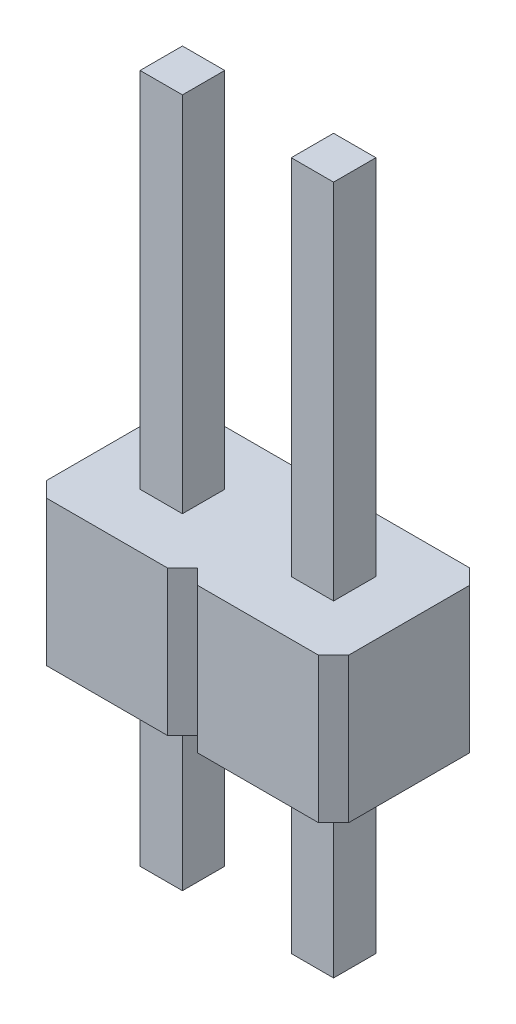
ISO-10303-21;
HEADER;
FILE_DESCRIPTION(('STEP AP214'),'2;1');
FILE_NAME('part.step','',(''),(''),'','','');
FILE_SCHEMA(('AUTOMOTIVE_DESIGN { 1 0 10303 214 1 1 1 1 }'));
ENDSEC;
DATA;
#1=APPLICATION_CONTEXT('core data for automotive mechanical design processes');
#2=APPLICATION_PROTOCOL_DEFINITION('international standard','automotive_design',2000,#1);
#3=PRODUCT_CONTEXT('',#1,'mechanical');
#4=PRODUCT('Part','Part','',(#3));
#5=PRODUCT_RELATED_PRODUCT_CATEGORY('part','',(#4));
#6=PRODUCT_DEFINITION_FORMATION('','',#4);
#7=PRODUCT_DEFINITION_CONTEXT('part definition',#1,'design');
#8=PRODUCT_DEFINITION('design','',#6,#7);
#9=PRODUCT_DEFINITION_SHAPE('','',#8);
#10=(LENGTH_UNIT() NAMED_UNIT(*) SI_UNIT(.MILLI.,.METRE.));
#11=(NAMED_UNIT(*) PLANE_ANGLE_UNIT() SI_UNIT($,.RADIAN.));
#12=(NAMED_UNIT(*) SI_UNIT($,.STERADIAN.) SOLID_ANGLE_UNIT());
#13=UNCERTAINTY_MEASURE_WITH_UNIT(LENGTH_MEASURE(1.E-05),#10,'distance_accuracy_value','');
#14=(GEOMETRIC_REPRESENTATION_CONTEXT(3) GLOBAL_UNCERTAINTY_ASSIGNED_CONTEXT((#13)) GLOBAL_UNIT_ASSIGNED_CONTEXT((#10,
#11,#12)) REPRESENTATION_CONTEXT('',''));
#15=CARTESIAN_POINT('',(0.,0.,0.));
#16=DIRECTION('',(0.,0.,1.));
#17=DIRECTION('',(1.,0.,0.));
#18=AXIS2_PLACEMENT_3D('',#15,#16,#17);
#19=CARTESIAN_POINT('',(0.,2.4,0.));
#20=DIRECTION('',(0.,-1.,0.));
#21=DIRECTION('',(0.,0.,-1.));
#22=AXIS2_PLACEMENT_3D('',#19,#20,#21);
#23=PLANE('',#22);
#24=DIRECTION('',(0.,0.,-1.));
#25=VECTOR('',#24,1.);
#26=CARTESIAN_POINT('',(-0.9,2.4,-0.35));
#27=LINE('',#26,#25);
#28=CARTESIAN_POINT('',(-0.9,2.4,0.35));
#29=VERTEX_POINT('',#28);
#30=CARTESIAN_POINT('',(-0.9,2.4,-0.35));
#31=VERTEX_POINT('',#30);
#32=EDGE_CURVE('E310',#29,#31,#27,.T.);
#33=ORIENTED_EDGE('',*,*,#32,.F.);
#34=DIRECTION('',(1.,0.,0.));
#35=VECTOR('',#34,1.);
#36=CARTESIAN_POINT('',(-1.6,2.4,0.35));
#37=LINE('',#36,#35);
#38=CARTESIAN_POINT('',(-1.6,2.4,0.35));
#39=VERTEX_POINT('',#38);
#40=EDGE_CURVE('E315',#39,#29,#37,.T.);
#41=ORIENTED_EDGE('',*,*,#40,.F.);
#42=DIRECTION('',(0.,0.,1.));
#43=VECTOR('',#42,1.);
#44=CARTESIAN_POINT('',(-1.6,2.4,-0.35));
#45=LINE('',#44,#43);
#46=CARTESIAN_POINT('',(-1.6,2.4,-0.35));
#47=VERTEX_POINT('',#46);
#48=EDGE_CURVE('E327',#47,#39,#45,.T.);
#49=ORIENTED_EDGE('',*,*,#48,.F.);
#50=DIRECTION('',(-1.,0.,0.));
#51=VECTOR('',#50,1.);
#52=CARTESIAN_POINT('',(-1.6,2.4,-0.35));
#53=LINE('',#52,#51);
#54=EDGE_CURVE('E324',#31,#47,#53,.T.);
#55=ORIENTED_EDGE('',*,*,#54,.F.);
#56=EDGE_LOOP('',(#33,#41,#49,#55));
#57=FACE_BOUND('',#56,.T.);
#58=DIRECTION('',(-0.707106781186548,0.,0.707106781186547));
#59=VECTOR('',#58,1.);
#60=CARTESIAN_POINT('',(-2.5,2.4,-1.));
#61=LINE('',#60,#59);
#62=CARTESIAN_POINT('',(-2.25,2.4,-1.25));
#63=VERTEX_POINT('',#62);
#64=CARTESIAN_POINT('',(-2.5,2.4,-1.));
#65=VERTEX_POINT('',#64);
#66=EDGE_CURVE('E344',#63,#65,#61,.T.);
#67=ORIENTED_EDGE('',*,*,#66,.T.);
#68=DIRECTION('',(0.,0.,1.));
#69=VECTOR('',#68,1.);
#70=CARTESIAN_POINT('',(-2.5,2.4,-1.));
#71=LINE('',#70,#69);
#72=CARTESIAN_POINT('',(-2.5,2.4,0.999999999999998));
#73=VERTEX_POINT('',#72);
#74=EDGE_CURVE('E347',#65,#73,#71,.T.);
#75=ORIENTED_EDGE('',*,*,#74,.T.);
#76=DIRECTION('',(0.707106781186544,0.,0.707106781186551));
#77=VECTOR('',#76,1.);
#78=CARTESIAN_POINT('',(-2.5,2.4,0.999999999999998));
#79=LINE('',#78,#77);
#80=CARTESIAN_POINT('',(-2.25,2.4,1.25));
#81=VERTEX_POINT('',#80);
#82=EDGE_CURVE('E350',#73,#81,#79,.T.);
#83=ORIENTED_EDGE('',*,*,#82,.T.);
#84=DIRECTION('',(1.,0.,0.));
#85=VECTOR('',#84,1.);
#86=CARTESIAN_POINT('',(-2.25,2.4,1.25));
#87=LINE('',#86,#85);
#88=CARTESIAN_POINT('',(-0.250000000000003,2.4,1.25));
#89=VERTEX_POINT('',#88);
#90=EDGE_CURVE('E352',#81,#89,#87,.T.);
#91=ORIENTED_EDGE('',*,*,#90,.T.);
#92=DIRECTION('',(0.707106781186551,0.,-0.707106781186544));
#93=VECTOR('',#92,1.);
#94=CARTESIAN_POINT('',(-0.250000000000003,2.4,1.25));
#95=LINE('',#94,#93);
#96=CARTESIAN_POINT('',(0.,2.4,0.999999999999999));
#97=VERTEX_POINT('',#96);
#98=EDGE_CURVE('E354',#89,#97,#95,.T.);
#99=ORIENTED_EDGE('',*,*,#98,.T.);
#100=DIRECTION('',(0.707106781186544,0.,0.707106781186551));
#101=VECTOR('',#100,1.);
#102=CARTESIAN_POINT('',(0.,2.4,0.999999999999999));
#103=LINE('',#102,#101);
#104=CARTESIAN_POINT('',(0.25,2.4,1.25));
#105=VERTEX_POINT('',#104);
#106=EDGE_CURVE('E356',#97,#105,#103,.T.);
#107=ORIENTED_EDGE('',*,*,#106,.T.);
#108=DIRECTION('',(1.,0.,0.));
#109=VECTOR('',#108,1.);
#110=CARTESIAN_POINT('',(0.25,2.4,1.25));
#111=LINE('',#110,#109);
#112=CARTESIAN_POINT('',(2.25,2.4,1.25));
#113=VERTEX_POINT('',#112);
#114=EDGE_CURVE('E358',#105,#113,#111,.T.);
#115=ORIENTED_EDGE('',*,*,#114,.T.);
#116=DIRECTION('',(0.707106781186546,0.,-0.707106781186549));
#117=VECTOR('',#116,1.);
#118=CARTESIAN_POINT('',(2.25,2.4,1.25));
#119=LINE('',#118,#117);
#120=CARTESIAN_POINT('',(2.5,2.4,0.999999999999999));
#121=VERTEX_POINT('',#120);
#122=EDGE_CURVE('E360',#113,#121,#119,.T.);
#123=ORIENTED_EDGE('',*,*,#122,.T.);
#124=DIRECTION('',(0.,0.,-1.));
#125=VECTOR('',#124,1.);
#126=CARTESIAN_POINT('',(2.5,2.4,-1.));
#127=LINE('',#126,#125);
#128=CARTESIAN_POINT('',(2.5,2.4,-1.));
#129=VERTEX_POINT('',#128);
#130=EDGE_CURVE('E362',#121,#129,#127,.T.);
#131=ORIENTED_EDGE('',*,*,#130,.T.);
#132=DIRECTION('',(-0.707106781186547,0.,-0.707106781186547));
#133=VECTOR('',#132,1.);
#134=CARTESIAN_POINT('',(2.5,2.4,-1.));
#135=LINE('',#134,#133);
#136=CARTESIAN_POINT('',(2.25,2.4,-1.25));
#137=VERTEX_POINT('',#136);
#138=EDGE_CURVE('E364',#129,#137,#135,.T.);
#139=ORIENTED_EDGE('',*,*,#138,.T.);
#140=DIRECTION('',(-1.,0.,0.));
#141=VECTOR('',#140,1.);
#142=CARTESIAN_POINT('',(0.25,2.4,-1.25));
#143=LINE('',#142,#141);
#144=CARTESIAN_POINT('',(0.25,2.4,-1.25));
#145=VERTEX_POINT('',#144);
#146=EDGE_CURVE('E366',#137,#145,#143,.T.);
#147=ORIENTED_EDGE('',*,*,#146,.T.);
#148=DIRECTION('',(-0.707106781186546,0.,0.707106781186549));
#149=VECTOR('',#148,1.);
#150=CARTESIAN_POINT('',(0.,2.4,-1.));
#151=LINE('',#150,#149);
#152=CARTESIAN_POINT('',(0.,2.4,-1.));
#153=VERTEX_POINT('',#152);
#154=EDGE_CURVE('E368',#145,#153,#151,.T.);
#155=ORIENTED_EDGE('',*,*,#154,.T.);
#156=DIRECTION('',(-0.707106781186548,0.,-0.707106781186547));
#157=VECTOR('',#156,1.);
#158=CARTESIAN_POINT('',(-0.25,2.4,-1.25));
#159=LINE('',#158,#157);
#160=CARTESIAN_POINT('',(-0.25,2.4,-1.25));
#161=VERTEX_POINT('',#160);
#162=EDGE_CURVE('E370',#153,#161,#159,.T.);
#163=ORIENTED_EDGE('',*,*,#162,.T.);
#164=DIRECTION('',(-1.,0.,0.));
#165=VECTOR('',#164,1.);
#166=CARTESIAN_POINT('',(-2.25,2.4,-1.25));
#167=LINE('',#166,#165);
#168=EDGE_CURVE('E372',#161,#63,#167,.T.);
#169=ORIENTED_EDGE('',*,*,#168,.T.);
#170=EDGE_LOOP('',(#67,#75,#83,#91,#99,#107,#115,#123,#131,#139,#147,#155,#163,#169));
#171=FACE_BOUND('',#170,.T.);
#172=DIRECTION('',(0.,0.,-1.));
#173=VECTOR('',#172,1.);
#174=CARTESIAN_POINT('',(1.6,2.4,-0.35));
#175=LINE('',#174,#173);
#176=CARTESIAN_POINT('',(1.6,2.4,0.35));
#177=VERTEX_POINT('',#176);
#178=CARTESIAN_POINT('',(1.6,2.4,-0.35));
#179=VERTEX_POINT('',#178);
#180=EDGE_CURVE('E272',#177,#179,#175,.T.);
#181=ORIENTED_EDGE('',*,*,#180,.F.);
#182=DIRECTION('',(1.,0.,0.));
#183=VECTOR('',#182,1.);
#184=CARTESIAN_POINT('',(0.900000000000001,2.4,0.35));
#185=LINE('',#184,#183);
#186=CARTESIAN_POINT('',(0.900000000000001,2.4,0.35));
#187=VERTEX_POINT('',#186);
#188=EDGE_CURVE('E282',#187,#177,#185,.T.);
#189=ORIENTED_EDGE('',*,*,#188,.F.);
#190=DIRECTION('',(0.,0.,1.));
#191=VECTOR('',#190,1.);
#192=CARTESIAN_POINT('',(0.9,2.4,-0.35));
#193=LINE('',#192,#191);
#194=CARTESIAN_POINT('',(0.9,2.4,-0.35));
#195=VERTEX_POINT('',#194);
#196=EDGE_CURVE('E294',#195,#187,#193,.T.);
#197=ORIENTED_EDGE('',*,*,#196,.F.);
#198=DIRECTION('',(-1.,0.,0.));
#199=VECTOR('',#198,1.);
#200=CARTESIAN_POINT('',(0.9,2.4,-0.35));
#201=LINE('',#200,#199);
#202=EDGE_CURVE('E291',#179,#195,#201,.T.);
#203=ORIENTED_EDGE('',*,*,#202,.F.);
#204=EDGE_LOOP('',(#181,#189,#197,#203));
#205=FACE_BOUND('',#204,.T.);
#206=ADVANCED_FACE('F33',(#57,#171,#205),#23,.F.);
#207=CARTESIAN_POINT('',(-2.5,2.4,-1.));
#208=DIRECTION('',(0.707106781186547,0.,0.707106781186548));
#209=DIRECTION('',(0.707106781186548,0.,-0.707106781186547));
#210=AXIS2_PLACEMENT_3D('',#207,#208,#209);
#211=PLANE('',#210);
#212=DIRECTION('',(-0.707106781186548,0.,0.707106781186547));
#213=VECTOR('',#212,1.);
#214=CARTESIAN_POINT('',(-2.5,0.,-1.));
#215=LINE('',#214,#213);
#216=CARTESIAN_POINT('',(-2.25,0.,-1.25));
#217=VERTEX_POINT('',#216);
#218=CARTESIAN_POINT('',(-2.5,0.,-1.));
#219=VERTEX_POINT('',#218);
#220=EDGE_CURVE('E343',#217,#219,#215,.T.);
#221=ORIENTED_EDGE('',*,*,#220,.T.);
#222=DIRECTION('',(0.,-1.,0.));
#223=VECTOR('',#222,1.);
#224=CARTESIAN_POINT('',(-2.5,2.4,-1.));
#225=LINE('',#224,#223);
#226=EDGE_CURVE('E440',#65,#219,#225,.T.);
#227=ORIENTED_EDGE('',*,*,#226,.F.);
#228=ORIENTED_EDGE('',*,*,#66,.F.);
#229=DIRECTION('',(0.,-1.,0.));
#230=VECTOR('',#229,1.);
#231=CARTESIAN_POINT('',(-2.25,2.4,-1.25));
#232=LINE('',#231,#230);
#233=EDGE_CURVE('E374',#63,#217,#232,.T.);
#234=ORIENTED_EDGE('',*,*,#233,.T.);
#235=EDGE_LOOP('',(#221,#227,#228,#234));
#236=FACE_BOUND('',#235,.T.);
#237=ADVANCED_FACE('F35',(#236),#211,.F.);
#238=CARTESIAN_POINT('',(-2.5,2.4,-1.));
#239=DIRECTION('',(1.,0.,0.));
#240=DIRECTION('',(0.,0.,-1.));
#241=AXIS2_PLACEMENT_3D('',#238,#239,#240);
#242=PLANE('',#241);
#243=DIRECTION('',(0.,0.,1.));
#244=VECTOR('',#243,1.);
#245=CARTESIAN_POINT('',(-2.5,0.,-1.));
#246=LINE('',#245,#244);
#247=CARTESIAN_POINT('',(-2.5,0.,0.999999999999998));
#248=VERTEX_POINT('',#247);
#249=EDGE_CURVE('E377',#219,#248,#246,.T.);
#250=ORIENTED_EDGE('',*,*,#249,.T.);
#251=DIRECTION('',(0.,-1.,0.));
#252=VECTOR('',#251,1.);
#253=CARTESIAN_POINT('',(-2.5,2.4,0.999999999999998));
#254=LINE('',#253,#252);
#255=EDGE_CURVE('E437',#73,#248,#254,.T.);
#256=ORIENTED_EDGE('',*,*,#255,.F.);
#257=ORIENTED_EDGE('',*,*,#74,.F.);
#258=ORIENTED_EDGE('',*,*,#226,.T.);
#259=EDGE_LOOP('',(#250,#256,#257,#258));
#260=FACE_BOUND('',#259,.T.);
#261=ADVANCED_FACE('F535',(#260),#242,.F.);
#262=CARTESIAN_POINT('',(-2.5,2.4,0.999999999999998));
#263=DIRECTION('',(0.70710678118655,0.,-0.707106781186544));
#264=DIRECTION('',(-0.707106781186545,0.,-0.707106781186551));
#265=AXIS2_PLACEMENT_3D('',#262,#263,#264);
#266=PLANE('',#265);
#267=DIRECTION('',(0.707106781186544,0.,0.707106781186551));
#268=VECTOR('',#267,1.);
#269=CARTESIAN_POINT('',(-2.5,0.,0.999999999999998));
#270=LINE('',#269,#268);
#271=CARTESIAN_POINT('',(-2.25,0.,1.25));
#272=VERTEX_POINT('',#271);
#273=EDGE_CURVE('E379',#248,#272,#270,.T.);
#274=ORIENTED_EDGE('',*,*,#273,.T.);
#275=DIRECTION('',(0.,-1.,0.));
#276=VECTOR('',#275,1.);
#277=CARTESIAN_POINT('',(-2.25,2.4,1.25));
#278=LINE('',#277,#276);
#279=EDGE_CURVE('E434',#81,#272,#278,.T.);
#280=ORIENTED_EDGE('',*,*,#279,.F.);
#281=ORIENTED_EDGE('',*,*,#82,.F.);
#282=ORIENTED_EDGE('',*,*,#255,.T.);
#283=EDGE_LOOP('',(#274,#280,#281,#282));
#284=FACE_BOUND('',#283,.T.);
#285=ADVANCED_FACE('F531',(#284),#266,.F.);
#286=CARTESIAN_POINT('',(-2.25,2.4,1.25));
#287=DIRECTION('',(0.,0.,-1.));
#288=DIRECTION('',(-1.,0.,0.));
#289=AXIS2_PLACEMENT_3D('',#286,#287,#288);
#290=PLANE('',#289);
#291=DIRECTION('',(1.,0.,0.));
#292=VECTOR('',#291,1.);
#293=CARTESIAN_POINT('',(-2.25,0.,1.25));
#294=LINE('',#293,#292);
#295=CARTESIAN_POINT('',(-0.250000000000003,0.,1.25));
#296=VERTEX_POINT('',#295);
#297=EDGE_CURVE('E381',#272,#296,#294,.T.);
#298=ORIENTED_EDGE('',*,*,#297,.T.);
#299=DIRECTION('',(0.,-1.,0.));
#300=VECTOR('',#299,1.);
#301=CARTESIAN_POINT('',(-0.250000000000003,2.4,1.25));
#302=LINE('',#301,#300);
#303=EDGE_CURVE('E431',#89,#296,#302,.T.);
#304=ORIENTED_EDGE('',*,*,#303,.F.);
#305=ORIENTED_EDGE('',*,*,#90,.F.);
#306=ORIENTED_EDGE('',*,*,#279,.T.);
#307=EDGE_LOOP('',(#298,#304,#305,#306));
#308=FACE_BOUND('',#307,.T.);
#309=ADVANCED_FACE('F528',(#308),#290,.F.);
#310=CARTESIAN_POINT('',(-0.250000000000003,2.4,1.25));
#311=DIRECTION('',(-0.707106781186544,0.,-0.707106781186551));
#312=DIRECTION('',(-0.707106781186551,0.,0.707106781186544));
#313=AXIS2_PLACEMENT_3D('',#310,#311,#312);
#314=PLANE('',#313);
#315=DIRECTION('',(0.707106781186551,0.,-0.707106781186544));
#316=VECTOR('',#315,1.);
#317=CARTESIAN_POINT('',(-0.250000000000003,0.,1.25));
#318=LINE('',#317,#316);
#319=CARTESIAN_POINT('',(0.,0.,0.999999999999999));
#320=VERTEX_POINT('',#319);
#321=EDGE_CURVE('E383',#296,#320,#318,.T.);
#322=ORIENTED_EDGE('',*,*,#321,.T.);
#323=DIRECTION('',(0.,-1.,0.));
#324=VECTOR('',#323,1.);
#325=CARTESIAN_POINT('',(0.,2.4,0.999999999999999));
#326=LINE('',#325,#324);
#327=EDGE_CURVE('E428',#97,#320,#326,.T.);
#328=ORIENTED_EDGE('',*,*,#327,.F.);
#329=ORIENTED_EDGE('',*,*,#98,.F.);
#330=ORIENTED_EDGE('',*,*,#303,.T.);
#331=EDGE_LOOP('',(#322,#328,#329,#330));
#332=FACE_BOUND('',#331,.T.);
#333=ADVANCED_FACE('F524',(#332),#314,.F.);
#334=CARTESIAN_POINT('',(0.,2.4,0.999999999999999));
#335=DIRECTION('',(0.707106781186551,0.,-0.707106781186544));
#336=DIRECTION('',(-0.707106781186544,0.,-0.707106781186551));
#337=AXIS2_PLACEMENT_3D('',#334,#335,#336);
#338=PLANE('',#337);
#339=DIRECTION('',(0.707106781186544,0.,0.707106781186551));
#340=VECTOR('',#339,1.);
#341=CARTESIAN_POINT('',(0.,0.,0.999999999999999));
#342=LINE('',#341,#340);
#343=CARTESIAN_POINT('',(0.25,0.,1.25));
#344=VERTEX_POINT('',#343);
#345=EDGE_CURVE('E385',#320,#344,#342,.T.);
#346=ORIENTED_EDGE('',*,*,#345,.T.);
#347=DIRECTION('',(0.,-1.,0.));
#348=VECTOR('',#347,1.);
#349=CARTESIAN_POINT('',(0.25,2.4,1.25));
#350=LINE('',#349,#348);
#351=EDGE_CURVE('E425',#105,#344,#350,.T.);
#352=ORIENTED_EDGE('',*,*,#351,.F.);
#353=ORIENTED_EDGE('',*,*,#106,.F.);
#354=ORIENTED_EDGE('',*,*,#327,.T.);
#355=EDGE_LOOP('',(#346,#352,#353,#354));
#356=FACE_BOUND('',#355,.T.);
#357=ADVANCED_FACE('F519',(#356),#338,.F.);
#358=CARTESIAN_POINT('',(0.25,2.4,1.25));
#359=DIRECTION('',(0.,0.,-1.));
#360=DIRECTION('',(-1.,0.,0.));
#361=AXIS2_PLACEMENT_3D('',#358,#359,#360);
#362=PLANE('',#361);
#363=DIRECTION('',(1.,0.,0.));
#364=VECTOR('',#363,1.);
#365=CARTESIAN_POINT('',(0.25,0.,1.25));
#366=LINE('',#365,#364);
#367=CARTESIAN_POINT('',(2.25,0.,1.25));
#368=VERTEX_POINT('',#367);
#369=EDGE_CURVE('E387',#344,#368,#366,.T.);
#370=ORIENTED_EDGE('',*,*,#369,.T.);
#371=DIRECTION('',(0.,-1.,0.));
#372=VECTOR('',#371,1.);
#373=CARTESIAN_POINT('',(2.25,2.4,1.25));
#374=LINE('',#373,#372);
#375=EDGE_CURVE('E422',#113,#368,#374,.T.);
#376=ORIENTED_EDGE('',*,*,#375,.F.);
#377=ORIENTED_EDGE('',*,*,#114,.F.);
#378=ORIENTED_EDGE('',*,*,#351,.T.);
#379=EDGE_LOOP('',(#370,#376,#377,#378));
#380=FACE_BOUND('',#379,.T.);
#381=ADVANCED_FACE('F513',(#380),#362,.F.);
#382=CARTESIAN_POINT('',(2.25,2.4,1.25));
#383=DIRECTION('',(-0.707106781186549,0.,-0.707106781186546));
#384=DIRECTION('',(-0.707106781186546,0.,0.707106781186549));
#385=AXIS2_PLACEMENT_3D('',#382,#383,#384);
#386=PLANE('',#385);
#387=DIRECTION('',(0.707106781186546,0.,-0.707106781186549));
#388=VECTOR('',#387,1.);
#389=CARTESIAN_POINT('',(2.25,0.,1.25));
#390=LINE('',#389,#388);
#391=CARTESIAN_POINT('',(2.5,0.,0.999999999999999));
#392=VERTEX_POINT('',#391);
#393=EDGE_CURVE('E389',#368,#392,#390,.T.);
#394=ORIENTED_EDGE('',*,*,#393,.T.);
#395=DIRECTION('',(0.,-1.,0.));
#396=VECTOR('',#395,1.);
#397=CARTESIAN_POINT('',(2.5,2.4,0.999999999999999));
#398=LINE('',#397,#396);
#399=EDGE_CURVE('E419',#121,#392,#398,.T.);
#400=ORIENTED_EDGE('',*,*,#399,.F.);
#401=ORIENTED_EDGE('',*,*,#122,.F.);
#402=ORIENTED_EDGE('',*,*,#375,.T.);
#403=EDGE_LOOP('',(#394,#400,#401,#402));
#404=FACE_BOUND('',#403,.T.);
#405=ADVANCED_FACE('F509',(#404),#386,.F.);
#406=CARTESIAN_POINT('',(2.5,2.4,-1.));
#407=DIRECTION('',(-1.,0.,0.));
#408=DIRECTION('',(0.,0.,1.));
#409=AXIS2_PLACEMENT_3D('',#406,#407,#408);
#410=PLANE('',#409);
#411=DIRECTION('',(0.,0.,-1.));
#412=VECTOR('',#411,1.);
#413=CARTESIAN_POINT('',(2.5,0.,-1.));
#414=LINE('',#413,#412);
#415=CARTESIAN_POINT('',(2.5,0.,-1.));
#416=VERTEX_POINT('',#415);
#417=EDGE_CURVE('E391',#392,#416,#414,.T.);
#418=ORIENTED_EDGE('',*,*,#417,.T.);
#419=DIRECTION('',(0.,-1.,0.));
#420=VECTOR('',#419,1.);
#421=CARTESIAN_POINT('',(2.5,2.4,-1.));
#422=LINE('',#421,#420);
#423=EDGE_CURVE('E416',#129,#416,#422,.T.);
#424=ORIENTED_EDGE('',*,*,#423,.F.);
#425=ORIENTED_EDGE('',*,*,#130,.F.);
#426=ORIENTED_EDGE('',*,*,#399,.T.);
#427=EDGE_LOOP('',(#418,#424,#425,#426));
#428=FACE_BOUND('',#427,.T.);
#429=ADVANCED_FACE('F504',(#428),#410,.F.);
#430=CARTESIAN_POINT('',(2.5,2.4,-1.));
#431=DIRECTION('',(-0.707106781186547,0.,0.707106781186547));
#432=DIRECTION('',(0.707106781186548,0.,0.707106781186548));
#433=AXIS2_PLACEMENT_3D('',#430,#431,#432);
#434=PLANE('',#433);
#435=DIRECTION('',(-0.707106781186547,0.,-0.707106781186547));
#436=VECTOR('',#435,1.);
#437=CARTESIAN_POINT('',(2.5,0.,-1.));
#438=LINE('',#437,#436);
#439=CARTESIAN_POINT('',(2.25,0.,-1.25));
#440=VERTEX_POINT('',#439);
#441=EDGE_CURVE('E393',#416,#440,#438,.T.);
#442=ORIENTED_EDGE('',*,*,#441,.T.);
#443=DIRECTION('',(0.,-1.,0.));
#444=VECTOR('',#443,1.);
#445=CARTESIAN_POINT('',(2.25,2.4,-1.25));
#446=LINE('',#445,#444);
#447=EDGE_CURVE('E413',#137,#440,#446,.T.);
#448=ORIENTED_EDGE('',*,*,#447,.F.);
#449=ORIENTED_EDGE('',*,*,#138,.F.);
#450=ORIENTED_EDGE('',*,*,#423,.T.);
#451=EDGE_LOOP('',(#442,#448,#449,#450));
#452=FACE_BOUND('',#451,.T.);
#453=ADVANCED_FACE('F498',(#452),#434,.F.);
#454=CARTESIAN_POINT('',(0.25,2.4,-1.25));
#455=DIRECTION('',(0.,0.,1.));
#456=DIRECTION('',(1.,0.,0.));
#457=AXIS2_PLACEMENT_3D('',#454,#455,#456);
#458=PLANE('',#457);
#459=DIRECTION('',(-1.,0.,0.));
#460=VECTOR('',#459,1.);
#461=CARTESIAN_POINT('',(0.25,0.,-1.25));
#462=LINE('',#461,#460);
#463=CARTESIAN_POINT('',(0.25,0.,-1.25));
#464=VERTEX_POINT('',#463);
#465=EDGE_CURVE('E395',#440,#464,#462,.T.);
#466=ORIENTED_EDGE('',*,*,#465,.T.);
#467=DIRECTION('',(0.,-1.,0.));
#468=VECTOR('',#467,1.);
#469=CARTESIAN_POINT('',(0.25,2.4,-1.25));
#470=LINE('',#469,#468);
#471=EDGE_CURVE('E410',#145,#464,#470,.T.);
#472=ORIENTED_EDGE('',*,*,#471,.F.);
#473=ORIENTED_EDGE('',*,*,#146,.F.);
#474=ORIENTED_EDGE('',*,*,#447,.T.);
#475=EDGE_LOOP('',(#466,#472,#473,#474));
#476=FACE_BOUND('',#475,.T.);
#477=ADVANCED_FACE('F494',(#476),#458,.F.);
#478=CARTESIAN_POINT('',(0.,2.4,-1.));
#479=DIRECTION('',(0.707106781186549,0.,0.707106781186546));
#480=DIRECTION('',(0.707106781186546,0.,-0.707106781186549));
#481=AXIS2_PLACEMENT_3D('',#478,#479,#480);
#482=PLANE('',#481);
#483=DIRECTION('',(-0.707106781186546,0.,0.707106781186549));
#484=VECTOR('',#483,1.);
#485=CARTESIAN_POINT('',(0.,0.,-1.));
#486=LINE('',#485,#484);
#487=CARTESIAN_POINT('',(0.,0.,-1.));
#488=VERTEX_POINT('',#487);
#489=EDGE_CURVE('E397',#464,#488,#486,.T.);
#490=ORIENTED_EDGE('',*,*,#489,.T.);
#491=DIRECTION('',(0.,-1.,0.));
#492=VECTOR('',#491,1.);
#493=CARTESIAN_POINT('',(0.,2.4,-1.));
#494=LINE('',#493,#492);
#495=EDGE_CURVE('E407',#153,#488,#494,.T.);
#496=ORIENTED_EDGE('',*,*,#495,.F.);
#497=ORIENTED_EDGE('',*,*,#154,.F.);
#498=ORIENTED_EDGE('',*,*,#471,.T.);
#499=EDGE_LOOP('',(#490,#496,#497,#498));
#500=FACE_BOUND('',#499,.T.);
#501=ADVANCED_FACE('F489',(#500),#482,.F.);
#502=CARTESIAN_POINT('',(-0.25,2.4,-1.25));
#503=DIRECTION('',(-0.707106781186547,0.,0.707106781186548));
#504=DIRECTION('',(0.707106781186548,0.,0.707106781186547));
#505=AXIS2_PLACEMENT_3D('',#502,#503,#504);
#506=PLANE('',#505);
#507=DIRECTION('',(-0.707106781186548,0.,-0.707106781186547));
#508=VECTOR('',#507,1.);
#509=CARTESIAN_POINT('',(-0.25,0.,-1.25));
#510=LINE('',#509,#508);
#511=CARTESIAN_POINT('',(-0.25,0.,-1.25));
#512=VERTEX_POINT('',#511);
#513=EDGE_CURVE('E399',#488,#512,#510,.T.);
#514=ORIENTED_EDGE('',*,*,#513,.T.);
#515=DIRECTION('',(0.,-1.,0.));
#516=VECTOR('',#515,1.);
#517=CARTESIAN_POINT('',(-0.25,2.4,-1.25));
#518=LINE('',#517,#516);
#519=EDGE_CURVE('E404',#161,#512,#518,.T.);
#520=ORIENTED_EDGE('',*,*,#519,.F.);
#521=ORIENTED_EDGE('',*,*,#162,.F.);
#522=ORIENTED_EDGE('',*,*,#495,.T.);
#523=EDGE_LOOP('',(#514,#520,#521,#522));
#524=FACE_BOUND('',#523,.T.);
#525=ADVANCED_FACE('F483',(#524),#506,.F.);
#526=CARTESIAN_POINT('',(-2.25,2.4,-1.25));
#527=DIRECTION('',(0.,0.,1.));
#528=DIRECTION('',(1.,0.,0.));
#529=AXIS2_PLACEMENT_3D('',#526,#527,#528);
#530=PLANE('',#529);
#531=DIRECTION('',(-1.,0.,0.));
#532=VECTOR('',#531,1.);
#533=CARTESIAN_POINT('',(-2.25,0.,-1.25));
#534=LINE('',#533,#532);
#535=EDGE_CURVE('E348',#512,#217,#534,.T.);
#536=ORIENTED_EDGE('',*,*,#535,.T.);
#537=ORIENTED_EDGE('',*,*,#233,.F.);
#538=ORIENTED_EDGE('',*,*,#168,.F.);
#539=ORIENTED_EDGE('',*,*,#519,.T.);
#540=EDGE_LOOP('',(#536,#537,#538,#539));
#541=FACE_BOUND('',#540,.T.);
#542=ADVANCED_FACE('F467',(#541),#530,.F.);
#543=CARTESIAN_POINT('',(0.,0.,0.));
#544=DIRECTION('',(0.,-1.,0.));
#545=DIRECTION('',(0.,0.,-1.));
#546=AXIS2_PLACEMENT_3D('',#543,#544,#545);
#547=PLANE('',#546);
#548=DIRECTION('',(0.,0.,-1.));
#549=VECTOR('',#548,1.);
#550=CARTESIAN_POINT('',(0.9,0.,0.));
#551=LINE('',#550,#549);
#552=CARTESIAN_POINT('',(0.9,0.,0.35));
#553=VERTEX_POINT('',#552);
#554=CARTESIAN_POINT('',(0.9,0.,-0.35));
#555=VERTEX_POINT('',#554);
#556=EDGE_CURVE('E11',#553,#555,#551,.T.);
#557=ORIENTED_EDGE('',*,*,#556,.F.);
#558=DIRECTION('',(-1.,0.,0.));
#559=VECTOR('',#558,1.);
#560=CARTESIAN_POINT('',(0.,0.,0.35));
#561=LINE('',#560,#559);
#562=CARTESIAN_POINT('',(1.6,0.,0.35));
#563=VERTEX_POINT('',#562);
#564=EDGE_CURVE('E41',#563,#553,#561,.T.);
#565=ORIENTED_EDGE('',*,*,#564,.F.);
#566=DIRECTION('',(0.,0.,1.));
#567=VECTOR('',#566,1.);
#568=CARTESIAN_POINT('',(1.6,0.,0.));
#569=LINE('',#568,#567);
#570=CARTESIAN_POINT('',(1.6,0.,-0.35));
#571=VERTEX_POINT('',#570);
#572=EDGE_CURVE('E457',#571,#563,#569,.T.);
#573=ORIENTED_EDGE('',*,*,#572,.F.);
#574=DIRECTION('',(1.,0.,0.));
#575=VECTOR('',#574,1.);
#576=CARTESIAN_POINT('',(0.,0.,-0.35));
#577=LINE('',#576,#575);
#578=EDGE_CURVE('E455',#555,#571,#577,.T.);
#579=ORIENTED_EDGE('',*,*,#578,.F.);
#580=EDGE_LOOP('',(#557,#565,#573,#579));
#581=FACE_BOUND('',#580,.T.);
#582=DIRECTION('',(0.,0.,1.));
#583=VECTOR('',#582,1.);
#584=CARTESIAN_POINT('',(-0.9,0.,0.));
#585=LINE('',#584,#583);
#586=CARTESIAN_POINT('',(-0.9,0.,-0.35));
#587=VERTEX_POINT('',#586);
#588=CARTESIAN_POINT('',(-0.9,0.,0.35));
#589=VERTEX_POINT('',#588);
#590=EDGE_CURVE('E452',#587,#589,#585,.T.);
#591=ORIENTED_EDGE('',*,*,#590,.F.);
#592=DIRECTION('',(1.,0.,0.));
#593=VECTOR('',#592,1.);
#594=CARTESIAN_POINT('',(0.,0.,-0.35));
#595=LINE('',#594,#593);
#596=CARTESIAN_POINT('',(-1.6,0.,-0.35));
#597=VERTEX_POINT('',#596);
#598=EDGE_CURVE('E449',#597,#587,#595,.T.);
#599=ORIENTED_EDGE('',*,*,#598,.F.);
#600=DIRECTION('',(0.,0.,-1.));
#601=VECTOR('',#600,1.);
#602=CARTESIAN_POINT('',(-1.6,0.,0.));
#603=LINE('',#602,#601);
#604=CARTESIAN_POINT('',(-1.6,0.,0.35));
#605=VERTEX_POINT('',#604);
#606=EDGE_CURVE('E446',#605,#597,#603,.T.);
#607=ORIENTED_EDGE('',*,*,#606,.F.);
#608=DIRECTION('',(-1.,0.,0.));
#609=VECTOR('',#608,1.);
#610=CARTESIAN_POINT('',(0.,0.,0.35));
#611=LINE('',#610,#609);
#612=EDGE_CURVE('E443',#589,#605,#611,.T.);
#613=ORIENTED_EDGE('',*,*,#612,.F.);
#614=EDGE_LOOP('',(#591,#599,#607,#613));
#615=FACE_BOUND('',#614,.T.);
#616=ORIENTED_EDGE('',*,*,#220,.F.);
#617=ORIENTED_EDGE('',*,*,#535,.F.);
#618=ORIENTED_EDGE('',*,*,#513,.F.);
#619=ORIENTED_EDGE('',*,*,#489,.F.);
#620=ORIENTED_EDGE('',*,*,#465,.F.);
#621=ORIENTED_EDGE('',*,*,#441,.F.);
#622=ORIENTED_EDGE('',*,*,#417,.F.);
#623=ORIENTED_EDGE('',*,*,#393,.F.);
#624=ORIENTED_EDGE('',*,*,#369,.F.);
#625=ORIENTED_EDGE('',*,*,#345,.F.);
#626=ORIENTED_EDGE('',*,*,#321,.F.);
#627=ORIENTED_EDGE('',*,*,#297,.F.);
#628=ORIENTED_EDGE('',*,*,#273,.F.);
#629=ORIENTED_EDGE('',*,*,#249,.F.);
#630=EDGE_LOOP('',(#616,#617,#618,#619,#620,#621,#622,#623,#624,#625,#626,#627,#628,#629));
#631=FACE_BOUND('',#630,.T.);
#632=ADVANCED_FACE('F463',(#581,#615,#631),#547,.T.);
#633=CARTESIAN_POINT('',(-0.9,8.4,-0.35));
#634=DIRECTION('',(-1.,0.,0.));
#635=DIRECTION('',(0.,0.,1.));
#636=AXIS2_PLACEMENT_3D('',#633,#634,#635);
#637=PLANE('',#636);
#638=ORIENTED_EDGE('',*,*,#32,.T.);
#639=DIRECTION('',(0.,-1.,0.));
#640=VECTOR('',#639,1.);
#641=CARTESIAN_POINT('',(-0.9,8.4,-0.35));
#642=LINE('',#641,#640);
#643=CARTESIAN_POINT('',(-0.9,8.4,-0.35));
#644=VERTEX_POINT('',#643);
#645=EDGE_CURVE('E340',#644,#31,#642,.T.);
#646=ORIENTED_EDGE('',*,*,#645,.F.);
#647=DIRECTION('',(0.,0.,-1.));
#648=VECTOR('',#647,1.);
#649=CARTESIAN_POINT('',(-0.9,8.4,-0.35));
#650=LINE('',#649,#648);
#651=CARTESIAN_POINT('',(-0.9,8.4,0.35));
#652=VERTEX_POINT('',#651);
#653=EDGE_CURVE('E311',#652,#644,#650,.T.);
#654=ORIENTED_EDGE('',*,*,#653,.F.);
#655=DIRECTION('',(0.,-1.,0.));
#656=VECTOR('',#655,1.);
#657=CARTESIAN_POINT('',(-0.9,8.4,0.35));
#658=LINE('',#657,#656);
#659=EDGE_CURVE('E321',#652,#29,#658,.T.);
#660=ORIENTED_EDGE('',*,*,#659,.T.);
#661=EDGE_LOOP('',(#638,#646,#654,#660));
#662=FACE_BOUND('',#661,.T.);
#663=ADVANCED_FACE('F466',(#662),#637,.F.);
#664=CARTESIAN_POINT('',(-1.6,8.4,-0.35));
#665=DIRECTION('',(0.,0.,1.));
#666=DIRECTION('',(1.,0.,0.));
#667=AXIS2_PLACEMENT_3D('',#664,#665,#666);
#668=PLANE('',#667);
#669=ORIENTED_EDGE('',*,*,#54,.T.);
#670=DIRECTION('',(0.,-1.,0.));
#671=VECTOR('',#670,1.);
#672=CARTESIAN_POINT('',(-1.6,8.4,-0.35));
#673=LINE('',#672,#671);
#674=CARTESIAN_POINT('',(-1.6,8.4,-0.35));
#675=VERTEX_POINT('',#674);
#676=EDGE_CURVE('E337',#675,#47,#673,.T.);
#677=ORIENTED_EDGE('',*,*,#676,.F.);
#678=DIRECTION('',(-1.,0.,0.));
#679=VECTOR('',#678,1.);
#680=CARTESIAN_POINT('',(-1.6,8.4,-0.35));
#681=LINE('',#680,#679);
#682=EDGE_CURVE('E314',#644,#675,#681,.T.);
#683=ORIENTED_EDGE('',*,*,#682,.F.);
#684=ORIENTED_EDGE('',*,*,#645,.T.);
#685=EDGE_LOOP('',(#669,#677,#683,#684));
#686=FACE_BOUND('',#685,.T.);
#687=ADVANCED_FACE('F579',(#686),#668,.F.);
#688=CARTESIAN_POINT('',(-1.6,8.4,-0.35));
#689=DIRECTION('',(1.,0.,0.));
#690=DIRECTION('',(0.,0.,-1.));
#691=AXIS2_PLACEMENT_3D('',#688,#689,#690);
#692=PLANE('',#691);
#693=ORIENTED_EDGE('',*,*,#48,.T.);
#694=DIRECTION('',(0.,-1.,0.));
#695=VECTOR('',#694,1.);
#696=CARTESIAN_POINT('',(-1.6,8.4,0.35));
#697=LINE('',#696,#695);
#698=CARTESIAN_POINT('',(-1.6,8.4,0.35));
#699=VERTEX_POINT('',#698);
#700=EDGE_CURVE('E334',#699,#39,#697,.T.);
#701=ORIENTED_EDGE('',*,*,#700,.F.);
#702=DIRECTION('',(0.,0.,1.));
#703=VECTOR('',#702,1.);
#704=CARTESIAN_POINT('',(-1.6,8.4,-0.35));
#705=LINE('',#704,#703);
#706=EDGE_CURVE('E317',#675,#699,#705,.T.);
#707=ORIENTED_EDGE('',*,*,#706,.F.);
#708=ORIENTED_EDGE('',*,*,#676,.T.);
#709=EDGE_LOOP('',(#693,#701,#707,#708));
#710=FACE_BOUND('',#709,.T.);
#711=ADVANCED_FACE('F575',(#710),#692,.F.);
#712=CARTESIAN_POINT('',(-1.6,8.4,0.35));
#713=DIRECTION('',(0.,0.,-1.));
#714=DIRECTION('',(-1.,0.,0.));
#715=AXIS2_PLACEMENT_3D('',#712,#713,#714);
#716=PLANE('',#715);
#717=ORIENTED_EDGE('',*,*,#40,.T.);
#718=ORIENTED_EDGE('',*,*,#659,.F.);
#719=DIRECTION('',(1.,0.,0.));
#720=VECTOR('',#719,1.);
#721=CARTESIAN_POINT('',(-1.6,8.4,0.35));
#722=LINE('',#721,#720);
#723=EDGE_CURVE('E319',#699,#652,#722,.T.);
#724=ORIENTED_EDGE('',*,*,#723,.F.);
#725=ORIENTED_EDGE('',*,*,#700,.T.);
#726=EDGE_LOOP('',(#717,#718,#724,#725));
#727=FACE_BOUND('',#726,.T.);
#728=ADVANCED_FACE('F571',(#727),#716,.F.);
#729=CARTESIAN_POINT('',(0.,8.4,0.));
#730=DIRECTION('',(0.,1.,0.));
#731=DIRECTION('',(0.,0.,1.));
#732=AXIS2_PLACEMENT_3D('',#729,#730,#731);
#733=PLANE('',#732);
#734=ORIENTED_EDGE('',*,*,#653,.T.);
#735=ORIENTED_EDGE('',*,*,#682,.T.);
#736=ORIENTED_EDGE('',*,*,#706,.T.);
#737=ORIENTED_EDGE('',*,*,#723,.T.);
#738=EDGE_LOOP('',(#734,#735,#736,#737));
#739=FACE_BOUND('',#738,.T.);
#740=ADVANCED_FACE('F565',(#739),#733,.T.);
#741=CARTESIAN_POINT('',(1.6,8.4,-0.35));
#742=DIRECTION('',(-1.,0.,0.));
#743=DIRECTION('',(0.,0.,1.));
#744=AXIS2_PLACEMENT_3D('',#741,#742,#743);
#745=PLANE('',#744);
#746=ORIENTED_EDGE('',*,*,#180,.T.);
#747=DIRECTION('',(0.,-1.,0.));
#748=VECTOR('',#747,1.);
#749=CARTESIAN_POINT('',(1.6,8.4,-0.35));
#750=LINE('',#749,#748);
#751=CARTESIAN_POINT('',(1.6,8.4,-0.35));
#752=VERTEX_POINT('',#751);
#753=EDGE_CURVE('E307',#752,#179,#750,.T.);
#754=ORIENTED_EDGE('',*,*,#753,.F.);
#755=DIRECTION('',(0.,0.,-1.));
#756=VECTOR('',#755,1.);
#757=CARTESIAN_POINT('',(1.6,8.4,-0.35));
#758=LINE('',#757,#756);
#759=CARTESIAN_POINT('',(1.6,8.4,0.35));
#760=VERTEX_POINT('',#759);
#761=EDGE_CURVE('E278',#760,#752,#758,.T.);
#762=ORIENTED_EDGE('',*,*,#761,.F.);
#763=DIRECTION('',(0.,-1.,0.));
#764=VECTOR('',#763,1.);
#765=CARTESIAN_POINT('',(1.6,8.4,0.35));
#766=LINE('',#765,#764);
#767=EDGE_CURVE('E288',#760,#177,#766,.T.);
#768=ORIENTED_EDGE('',*,*,#767,.T.);
#769=EDGE_LOOP('',(#746,#754,#762,#768));
#770=FACE_BOUND('',#769,.T.);
#771=ADVANCED_FACE('F549',(#770),#745,.F.);
#772=CARTESIAN_POINT('',(0.9,8.4,-0.35));
#773=DIRECTION('',(0.,0.,1.));
#774=DIRECTION('',(1.,0.,0.));
#775=AXIS2_PLACEMENT_3D('',#772,#773,#774);
#776=PLANE('',#775);
#777=ORIENTED_EDGE('',*,*,#202,.T.);
#778=DIRECTION('',(0.,-1.,0.));
#779=VECTOR('',#778,1.);
#780=CARTESIAN_POINT('',(0.9,8.4,-0.35));
#781=LINE('',#780,#779);
#782=CARTESIAN_POINT('',(0.9,8.4,-0.35));
#783=VERTEX_POINT('',#782);
#784=EDGE_CURVE('E304',#783,#195,#781,.T.);
#785=ORIENTED_EDGE('',*,*,#784,.F.);
#786=DIRECTION('',(-1.,0.,0.));
#787=VECTOR('',#786,1.);
#788=CARTESIAN_POINT('',(0.9,8.4,-0.35));
#789=LINE('',#788,#787);
#790=EDGE_CURVE('E281',#752,#783,#789,.T.);
#791=ORIENTED_EDGE('',*,*,#790,.F.);
#792=ORIENTED_EDGE('',*,*,#753,.T.);
#793=EDGE_LOOP('',(#777,#785,#791,#792));
#794=FACE_BOUND('',#793,.T.);
#795=ADVANCED_FACE('F557',(#794),#776,.F.);
#796=CARTESIAN_POINT('',(0.9,8.4,-0.35));
#797=DIRECTION('',(1.,0.,0.));
#798=DIRECTION('',(0.,0.,-1.));
#799=AXIS2_PLACEMENT_3D('',#796,#797,#798);
#800=PLANE('',#799);
#801=ORIENTED_EDGE('',*,*,#196,.T.);
#802=DIRECTION('',(0.,-1.,0.));
#803=VECTOR('',#802,1.);
#804=CARTESIAN_POINT('',(0.900000000000001,8.4,0.35));
#805=LINE('',#804,#803);
#806=CARTESIAN_POINT('',(0.900000000000001,8.4,0.35));
#807=VERTEX_POINT('',#806);
#808=EDGE_CURVE('E301',#807,#187,#805,.T.);
#809=ORIENTED_EDGE('',*,*,#808,.F.);
#810=DIRECTION('',(0.,0.,1.));
#811=VECTOR('',#810,1.);
#812=CARTESIAN_POINT('',(0.9,8.4,-0.35));
#813=LINE('',#812,#811);
#814=EDGE_CURVE('E284',#783,#807,#813,.T.);
#815=ORIENTED_EDGE('',*,*,#814,.F.);
#816=ORIENTED_EDGE('',*,*,#784,.T.);
#817=EDGE_LOOP('',(#801,#809,#815,#816));
#818=FACE_BOUND('',#817,.T.);
#819=ADVANCED_FACE('F555',(#818),#800,.F.);
#820=CARTESIAN_POINT('',(0.900000000000001,8.4,0.35));
#821=DIRECTION('',(0.,0.,-1.));
#822=DIRECTION('',(-1.,0.,0.));
#823=AXIS2_PLACEMENT_3D('',#820,#821,#822);
#824=PLANE('',#823);
#825=ORIENTED_EDGE('',*,*,#188,.T.);
#826=ORIENTED_EDGE('',*,*,#767,.F.);
#827=DIRECTION('',(1.,0.,0.));
#828=VECTOR('',#827,1.);
#829=CARTESIAN_POINT('',(0.900000000000001,8.4,0.35));
#830=LINE('',#829,#828);
#831=EDGE_CURVE('E286',#807,#760,#830,.T.);
#832=ORIENTED_EDGE('',*,*,#831,.F.);
#833=ORIENTED_EDGE('',*,*,#808,.T.);
#834=EDGE_LOOP('',(#825,#826,#832,#833));
#835=FACE_BOUND('',#834,.T.);
#836=ADVANCED_FACE('F545',(#835),#824,.F.);
#837=CARTESIAN_POINT('',(0.,8.4,0.));
#838=DIRECTION('',(0.,1.,0.));
#839=DIRECTION('',(0.,0.,1.));
#840=AXIS2_PLACEMENT_3D('',#837,#838,#839);
#841=PLANE('',#840);
#842=ORIENTED_EDGE('',*,*,#761,.T.);
#843=ORIENTED_EDGE('',*,*,#790,.T.);
#844=ORIENTED_EDGE('',*,*,#814,.T.);
#845=ORIENTED_EDGE('',*,*,#831,.T.);
#846=EDGE_LOOP('',(#842,#843,#844,#845));
#847=FACE_BOUND('',#846,.T.);
#848=ADVANCED_FACE('F551',(#847),#841,.T.);
#849=CARTESIAN_POINT('',(-0.9,2.,0.35));
#850=DIRECTION('',(1.,0.,0.));
#851=DIRECTION('',(0.,0.,-1.));
#852=AXIS2_PLACEMENT_3D('',#849,#850,#851);
#853=PLANE('',#852);
#854=DIRECTION('',(0.,-1.,0.));
#855=VECTOR('',#854,1.);
#856=CARTESIAN_POINT('',(-0.9,2.,-0.35));
#857=LINE('',#856,#855);
#858=CARTESIAN_POINT('',(-0.9,-3.,-0.35));
#859=VERTEX_POINT('',#858);
#860=EDGE_CURVE('E270',#587,#859,#857,.T.);
#861=ORIENTED_EDGE('',*,*,#860,.F.);
#862=ORIENTED_EDGE('',*,*,#590,.T.);
#863=DIRECTION('',(0.,-1.,0.));
#864=VECTOR('',#863,1.);
#865=CARTESIAN_POINT('',(-0.9,2.,0.35));
#866=LINE('',#865,#864);
#867=CARTESIAN_POINT('',(-0.9,-3.,0.35));
#868=VERTEX_POINT('',#867);
#869=EDGE_CURVE('E269',#589,#868,#866,.T.);
#870=ORIENTED_EDGE('',*,*,#869,.T.);
#871=DIRECTION('',(0.,0.,1.));
#872=VECTOR('',#871,1.);
#873=CARTESIAN_POINT('',(-0.9,-3.,0.35));
#874=LINE('',#873,#872);
#875=EDGE_CURVE('E254',#859,#868,#874,.T.);
#876=ORIENTED_EDGE('',*,*,#875,.F.);
#877=EDGE_LOOP('',(#861,#862,#870,#876));
#878=FACE_BOUND('',#877,.T.);
#879=ADVANCED_FACE('F687',(#878),#853,.T.);
#880=CARTESIAN_POINT('',(-1.6,2.,-0.35));
#881=DIRECTION('',(0.,0.,-1.));
#882=DIRECTION('',(-1.,0.,0.));
#883=AXIS2_PLACEMENT_3D('',#880,#881,#882);
#884=PLANE('',#883);
#885=DIRECTION('',(0.,-1.,0.));
#886=VECTOR('',#885,1.);
#887=CARTESIAN_POINT('',(-1.6,2.,-0.35));
#888=LINE('',#887,#886);
#889=CARTESIAN_POINT('',(-1.6,-3.,-0.35));
#890=VERTEX_POINT('',#889);
#891=EDGE_CURVE('E273',#597,#890,#888,.T.);
#892=ORIENTED_EDGE('',*,*,#891,.F.);
#893=ORIENTED_EDGE('',*,*,#598,.T.);
#894=ORIENTED_EDGE('',*,*,#860,.T.);
#895=DIRECTION('',(1.,0.,0.));
#896=VECTOR('',#895,1.);
#897=CARTESIAN_POINT('',(-1.6,-3.,-0.35));
#898=LINE('',#897,#896);
#899=EDGE_CURVE('E266',#890,#859,#898,.T.);
#900=ORIENTED_EDGE('',*,*,#899,.F.);
#901=EDGE_LOOP('',(#892,#893,#894,#900));
#902=FACE_BOUND('',#901,.T.);
#903=ADVANCED_FACE('F701',(#902),#884,.T.);
#904=CARTESIAN_POINT('',(-1.6,2.,0.35));
#905=DIRECTION('',(-1.,0.,0.));
#906=DIRECTION('',(0.,0.,1.));
#907=AXIS2_PLACEMENT_3D('',#904,#905,#906);
#908=PLANE('',#907);
#909=DIRECTION('',(0.,-1.,0.));
#910=VECTOR('',#909,1.);
#911=CARTESIAN_POINT('',(-1.6,2.,0.35));
#912=LINE('',#911,#910);
#913=CARTESIAN_POINT('',(-1.6,-3.,0.35));
#914=VERTEX_POINT('',#913);
#915=EDGE_CURVE('E275',#605,#914,#912,.T.);
#916=ORIENTED_EDGE('',*,*,#915,.F.);
#917=ORIENTED_EDGE('',*,*,#606,.T.);
#918=ORIENTED_EDGE('',*,*,#891,.T.);
#919=DIRECTION('',(0.,0.,-1.));
#920=VECTOR('',#919,1.);
#921=CARTESIAN_POINT('',(-1.6,-3.,0.35));
#922=LINE('',#921,#920);
#923=EDGE_CURVE('E263',#914,#890,#922,.T.);
#924=ORIENTED_EDGE('',*,*,#923,.F.);
#925=EDGE_LOOP('',(#916,#917,#918,#924));
#926=FACE_BOUND('',#925,.T.);
#927=ADVANCED_FACE('F711',(#926),#908,.T.);
#928=CARTESIAN_POINT('',(-1.6,2.,0.35));
#929=DIRECTION('',(0.,0.,1.));
#930=DIRECTION('',(1.,0.,0.));
#931=AXIS2_PLACEMENT_3D('',#928,#929,#930);
#932=PLANE('',#931);
#933=ORIENTED_EDGE('',*,*,#869,.F.);
#934=ORIENTED_EDGE('',*,*,#612,.T.);
#935=ORIENTED_EDGE('',*,*,#915,.T.);
#936=DIRECTION('',(-1.,0.,0.));
#937=VECTOR('',#936,1.);
#938=CARTESIAN_POINT('',(-1.6,-3.,0.35));
#939=LINE('',#938,#937);
#940=EDGE_CURVE('E260',#868,#914,#939,.T.);
#941=ORIENTED_EDGE('',*,*,#940,.F.);
#942=EDGE_LOOP('',(#933,#934,#935,#941));
#943=FACE_BOUND('',#942,.T.);
#944=ADVANCED_FACE('F721',(#943),#932,.T.);
#945=CARTESIAN_POINT('',(0.,-3.,0.));
#946=DIRECTION('',(0.,-1.,0.));
#947=DIRECTION('',(0.,0.,-1.));
#948=AXIS2_PLACEMENT_3D('',#945,#946,#947);
#949=PLANE('',#948);
#950=ORIENTED_EDGE('',*,*,#875,.T.);
#951=ORIENTED_EDGE('',*,*,#940,.T.);
#952=ORIENTED_EDGE('',*,*,#923,.T.);
#953=ORIENTED_EDGE('',*,*,#899,.T.);
#954=EDGE_LOOP('',(#950,#951,#952,#953));
#955=FACE_BOUND('',#954,.T.);
#956=ADVANCED_FACE('F731',(#955),#949,.T.);
#957=CARTESIAN_POINT('',(0.9,2.,-0.35));
#958=DIRECTION('',(-1.,0.,0.));
#959=DIRECTION('',(0.,0.,1.));
#960=AXIS2_PLACEMENT_3D('',#957,#958,#959);
#961=PLANE('',#960);
#962=DIRECTION('',(0.,-1.,0.));
#963=VECTOR('',#962,1.);
#964=CARTESIAN_POINT('',(0.9,2.,0.35));
#965=LINE('',#964,#963);
#966=CARTESIAN_POINT('',(0.9,-3.,0.35));
#967=VERTEX_POINT('',#966);
#968=EDGE_CURVE('E252',#553,#967,#965,.T.);
#969=ORIENTED_EDGE('',*,*,#968,.F.);
#970=ORIENTED_EDGE('',*,*,#556,.T.);
#971=DIRECTION('',(0.,-1.,0.));
#972=VECTOR('',#971,1.);
#973=CARTESIAN_POINT('',(0.9,2.,-0.35));
#974=LINE('',#973,#972);
#975=CARTESIAN_POINT('',(0.9,-3.,-0.35));
#976=VERTEX_POINT('',#975);
#977=EDGE_CURVE('E225',#555,#976,#974,.T.);
#978=ORIENTED_EDGE('',*,*,#977,.T.);
#979=DIRECTION('',(0.,0.,-1.));
#980=VECTOR('',#979,1.);
#981=CARTESIAN_POINT('',(0.9,-3.,-0.35));
#982=LINE('',#981,#980);
#983=EDGE_CURVE('E230',#967,#976,#982,.T.);
#984=ORIENTED_EDGE('',*,*,#983,.F.);
#985=EDGE_LOOP('',(#969,#970,#978,#984));
#986=FACE_BOUND('',#985,.T.);
#987=ADVANCED_FACE('F228',(#986),#961,.T.);
#988=CARTESIAN_POINT('',(1.6,2.,0.35));
#989=DIRECTION('',(0.,0.,1.));
#990=DIRECTION('',(1.,0.,0.));
#991=AXIS2_PLACEMENT_3D('',#988,#989,#990);
#992=PLANE('',#991);
#993=DIRECTION('',(0.,-1.,0.));
#994=VECTOR('',#993,1.);
#995=CARTESIAN_POINT('',(1.6,2.,0.35));
#996=LINE('',#995,#994);
#997=CARTESIAN_POINT('',(1.6,-3.,0.35));
#998=VERTEX_POINT('',#997);
#999=EDGE_CURVE('E255',#563,#998,#996,.T.);
#1000=ORIENTED_EDGE('',*,*,#999,.F.);
#1001=ORIENTED_EDGE('',*,*,#564,.T.);
#1002=ORIENTED_EDGE('',*,*,#968,.T.);
#1003=DIRECTION('',(-1.,0.,0.));
#1004=VECTOR('',#1003,1.);
#1005=CARTESIAN_POINT('',(1.6,-3.,0.35));
#1006=LINE('',#1005,#1004);
#1007=EDGE_CURVE('E234',#998,#967,#1006,.T.);
#1008=ORIENTED_EDGE('',*,*,#1007,.F.);
#1009=EDGE_LOOP('',(#1000,#1001,#1002,#1008));
#1010=FACE_BOUND('',#1009,.T.);
#1011=ADVANCED_FACE('F460',(#1010),#992,.T.);
#1012=CARTESIAN_POINT('',(1.6,2.,-0.35));
#1013=DIRECTION('',(1.,0.,0.));
#1014=DIRECTION('',(0.,0.,-1.));
#1015=AXIS2_PLACEMENT_3D('',#1012,#1013,#1014);
#1016=PLANE('',#1015);
#1017=DIRECTION('',(0.,-1.,0.));
#1018=VECTOR('',#1017,1.);
#1019=CARTESIAN_POINT('',(1.6,2.,-0.35));
#1020=LINE('',#1019,#1018);
#1021=CARTESIAN_POINT('',(1.6,-3.,-0.35));
#1022=VERTEX_POINT('',#1021);
#1023=EDGE_CURVE('E233',#571,#1022,#1020,.T.);
#1024=ORIENTED_EDGE('',*,*,#1023,.F.);
#1025=ORIENTED_EDGE('',*,*,#572,.T.);
#1026=ORIENTED_EDGE('',*,*,#999,.T.);
#1027=DIRECTION('',(0.,0.,1.));
#1028=VECTOR('',#1027,1.);
#1029=CARTESIAN_POINT('',(1.6,-3.,-0.35));
#1030=LINE('',#1029,#1028);
#1031=EDGE_CURVE('E243',#1022,#998,#1030,.T.);
#1032=ORIENTED_EDGE('',*,*,#1031,.F.);
#1033=EDGE_LOOP('',(#1024,#1025,#1026,#1032));
#1034=FACE_BOUND('',#1033,.T.);
#1035=ADVANCED_FACE('F462',(#1034),#1016,.T.);
#1036=CARTESIAN_POINT('',(1.6,2.,-0.35));
#1037=DIRECTION('',(0.,0.,-1.));
#1038=DIRECTION('',(-1.,0.,0.));
#1039=AXIS2_PLACEMENT_3D('',#1036,#1037,#1038);
#1040=PLANE('',#1039);
#1041=ORIENTED_EDGE('',*,*,#977,.F.);
#1042=ORIENTED_EDGE('',*,*,#578,.T.);
#1043=ORIENTED_EDGE('',*,*,#1023,.T.);
#1044=DIRECTION('',(1.,0.,0.));
#1045=VECTOR('',#1044,1.);
#1046=CARTESIAN_POINT('',(1.6,-3.,-0.35));
#1047=LINE('',#1046,#1045);
#1048=EDGE_CURVE('E237',#976,#1022,#1047,.T.);
#1049=ORIENTED_EDGE('',*,*,#1048,.F.);
#1050=EDGE_LOOP('',(#1041,#1042,#1043,#1049));
#1051=FACE_BOUND('',#1050,.T.);
#1052=ADVANCED_FACE('F238',(#1051),#1040,.T.);
#1053=CARTESIAN_POINT('',(0.,-3.,0.));
#1054=DIRECTION('',(0.,-1.,0.));
#1055=DIRECTION('',(0.,0.,-1.));
#1056=AXIS2_PLACEMENT_3D('',#1053,#1054,#1055);
#1057=PLANE('',#1056);
#1058=ORIENTED_EDGE('',*,*,#983,.T.);
#1059=ORIENTED_EDGE('',*,*,#1048,.T.);
#1060=ORIENTED_EDGE('',*,*,#1031,.T.);
#1061=ORIENTED_EDGE('',*,*,#1007,.T.);
#1062=EDGE_LOOP('',(#1058,#1059,#1060,#1061));
#1063=FACE_BOUND('',#1062,.T.);
#1064=ADVANCED_FACE('F246',(#1063),#1057,.T.);
#1065=CLOSED_SHELL('',(#206,#237,#261,#285,#309,#333,#357,#381,#405,#429,#453,#477,#501,#525,
#542,#632,#663,#687,#711,#728,#740,#771,#795,#819,#836,#848,#879,#903,#927,#944,#956,#987,#1011,
#1035,#1052,#1064));
#1066=MANIFOLD_SOLID_BREP('B2',#1065);
#1067=ADVANCED_BREP_SHAPE_REPRESENTATION('',(#18,#1066),#14);
#1068=SHAPE_DEFINITION_REPRESENTATION(#9,#1067);
ENDSEC;
END-ISO-10303-21;
